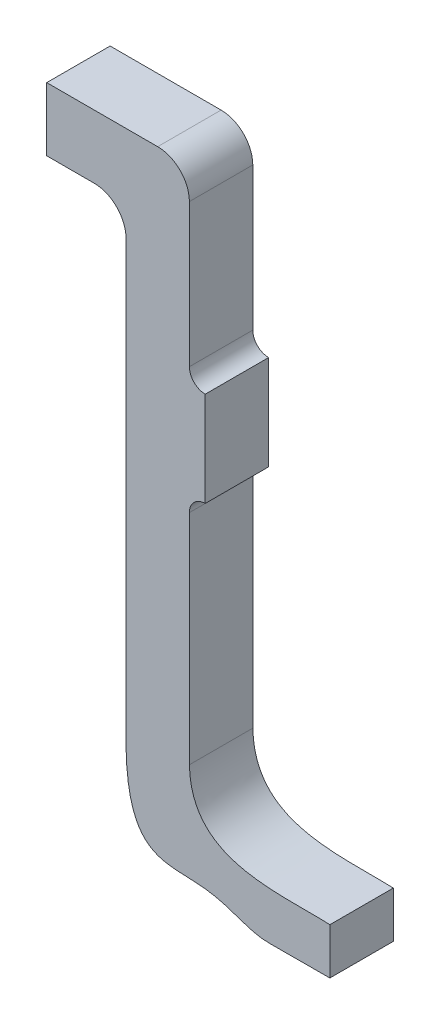
ISO-10303-21;
HEADER;
FILE_DESCRIPTION(('STEP AP214'),'2;1');
FILE_NAME('part.step','',(''),(''),'','','');
FILE_SCHEMA(('AUTOMOTIVE_DESIGN { 1 0 10303 214 1 1 1 1 }'));
ENDSEC;
DATA;
#1=APPLICATION_CONTEXT('core data for automotive mechanical design processes');
#2=APPLICATION_PROTOCOL_DEFINITION('international standard','automotive_design',2000,#1);
#3=PRODUCT_CONTEXT('',#1,'mechanical');
#4=PRODUCT('Part','Part','',(#3));
#5=PRODUCT_RELATED_PRODUCT_CATEGORY('part','',(#4));
#6=PRODUCT_DEFINITION_FORMATION('','',#4);
#7=PRODUCT_DEFINITION_CONTEXT('part definition',#1,'design');
#8=PRODUCT_DEFINITION('design','',#6,#7);
#9=PRODUCT_DEFINITION_SHAPE('','',#8);
#10=(LENGTH_UNIT() NAMED_UNIT(*) SI_UNIT(.MILLI.,.METRE.));
#11=(NAMED_UNIT(*) PLANE_ANGLE_UNIT() SI_UNIT($,.RADIAN.));
#12=(NAMED_UNIT(*) SI_UNIT($,.STERADIAN.) SOLID_ANGLE_UNIT());
#13=UNCERTAINTY_MEASURE_WITH_UNIT(LENGTH_MEASURE(1.E-05),#10,'distance_accuracy_value','');
#14=(GEOMETRIC_REPRESENTATION_CONTEXT(3) GLOBAL_UNCERTAINTY_ASSIGNED_CONTEXT((#13)) GLOBAL_UNIT_ASSIGNED_CONTEXT((#10,
#11,#12)) REPRESENTATION_CONTEXT('',''));
#15=CARTESIAN_POINT('',(0.,0.,0.));
#16=DIRECTION('',(0.,0.,1.));
#17=DIRECTION('',(1.,0.,0.));
#18=AXIS2_PLACEMENT_3D('',#15,#16,#17);
#19=CARTESIAN_POINT('',(0.4,0.,0.2));
#20=DIRECTION('',(1.,0.,0.));
#21=DIRECTION('',(0.,1.,0.));
#22=AXIS2_PLACEMENT_3D('',#19,#20,#21);
#23=PLANE('',#22);
#24=DIRECTION('',(0.,-1.,0.));
#25=VECTOR('',#24,1.);
#26=CARTESIAN_POINT('',(0.4,0.,0.));
#27=LINE('',#26,#25);
#28=CARTESIAN_POINT('',(0.4,1.04971801777675,0.));
#29=VERTEX_POINT('',#28);
#30=CARTESIAN_POINT('',(0.4,0.360929099643731,0.));
#31=VERTEX_POINT('',#30);
#32=EDGE_CURVE('E252',#29,#31,#27,.T.);
#33=ORIENTED_EDGE('',*,*,#32,.F.);
#34=DIRECTION('',(0.,0.,-1.));
#35=VECTOR('',#34,1.);
#36=CARTESIAN_POINT('',(0.4,1.04971801777675,0.2));
#37=LINE('',#36,#35);
#38=CARTESIAN_POINT('',(0.4,1.04971801777675,0.2));
#39=VERTEX_POINT('',#38);
#40=EDGE_CURVE('E293',#29,#39,#37,.F.);
#41=ORIENTED_EDGE('',*,*,#40,.T.);
#42=DIRECTION('',(0.,-1.,0.));
#43=VECTOR('',#42,1.);
#44=CARTESIAN_POINT('',(0.4,0.,0.2));
#45=LINE('',#44,#43);
#46=CARTESIAN_POINT('',(0.4,0.360929099643731,0.2));
#47=VERTEX_POINT('',#46);
#48=EDGE_CURVE('E141',#39,#47,#45,.T.);
#49=ORIENTED_EDGE('',*,*,#48,.T.);
#50=DIRECTION('',(0.,0.,-1.));
#51=VECTOR('',#50,1.);
#52=CARTESIAN_POINT('',(0.4,0.360929099643731,0.2));
#53=LINE('',#52,#51);
#54=EDGE_CURVE('E283',#47,#31,#53,.T.);
#55=ORIENTED_EDGE('',*,*,#54,.T.);
#56=EDGE_LOOP('',(#33,#41,#49,#55));
#57=FACE_BOUND('',#56,.T.);
#58=ADVANCED_FACE('F35',(#57),#23,.T.);
#59=CARTESIAN_POINT('',(0.4,1.89937490231322,0.2));
#60=VERTEX_POINT('',#59);
#61=CARTESIAN_POINT('',(0.4,1.44832216385116,0.2));
#62=VERTEX_POINT('',#61);
#63=EDGE_CURVE('E216',#60,#62,#45,.T.);
#64=ORIENTED_EDGE('',*,*,#63,.T.);
#65=DIRECTION('',(0.,0.,1.));
#66=VECTOR('',#65,1.);
#67=CARTESIAN_POINT('',(0.4,1.44832216385116,0.2));
#68=LINE('',#67,#66);
#69=CARTESIAN_POINT('',(0.4,1.44832216385116,0.));
#70=VERTEX_POINT('',#69);
#71=EDGE_CURVE('E50',#62,#70,#68,.F.);
#72=ORIENTED_EDGE('',*,*,#71,.T.);
#73=CARTESIAN_POINT('',(0.4,1.89937490231322,0.));
#74=VERTEX_POINT('',#73);
#75=EDGE_CURVE('E253',#74,#70,#27,.T.);
#76=ORIENTED_EDGE('',*,*,#75,.F.);
#77=DIRECTION('',(0.,0.,-1.));
#78=VECTOR('',#77,1.);
#79=CARTESIAN_POINT('',(0.4,1.89937490231322,0.2));
#80=LINE('',#79,#78);
#81=EDGE_CURVE('E281',#60,#74,#80,.T.);
#82=ORIENTED_EDGE('',*,*,#81,.F.);
#83=EDGE_LOOP('',(#64,#72,#76,#82));
#84=FACE_BOUND('',#83,.T.);
#85=ADVANCED_FACE('F187',(#84),#23,.T.);
#86=CARTESIAN_POINT('',(0.2,0.,0.2));
#87=DIRECTION('',(1.,0.,0.));
#88=DIRECTION('',(0.,0.,-1.));
#89=AXIS2_PLACEMENT_3D('',#86,#87,#88);
#90=PLANE('',#89);
#91=DIRECTION('',(0.,-1.,0.));
#92=VECTOR('',#91,1.);
#93=CARTESIAN_POINT('',(0.2,0.,0.));
#94=LINE('',#93,#92);
#95=CARTESIAN_POINT('',(0.2,1.69937490231322,0.));
#96=VERTEX_POINT('',#95);
#97=CARTESIAN_POINT('',(0.2,0.313998399548533,0.));
#98=VERTEX_POINT('',#97);
#99=EDGE_CURVE('E163',#96,#98,#94,.T.);
#100=ORIENTED_EDGE('',*,*,#99,.T.);
#101=DIRECTION('',(0.,0.,-1.));
#102=VECTOR('',#101,1.);
#103=CARTESIAN_POINT('',(0.2,0.313998399548533,0.2));
#104=LINE('',#103,#102);
#105=CARTESIAN_POINT('',(0.2,0.313998399548533,0.2));
#106=VERTEX_POINT('',#105);
#107=EDGE_CURVE('E290',#106,#98,#104,.T.);
#108=ORIENTED_EDGE('',*,*,#107,.F.);
#109=DIRECTION('',(0.,-1.,0.));
#110=VECTOR('',#109,1.);
#111=CARTESIAN_POINT('',(0.2,0.,0.2));
#112=LINE('',#111,#110);
#113=CARTESIAN_POINT('',(0.2,1.69937490231322,0.2));
#114=VERTEX_POINT('',#113);
#115=EDGE_CURVE('E164',#114,#106,#112,.T.);
#116=ORIENTED_EDGE('',*,*,#115,.F.);
#117=DIRECTION('',(0.,0.,-1.));
#118=VECTOR('',#117,1.);
#119=CARTESIAN_POINT('',(0.2,1.69937490231322,0.2));
#120=LINE('',#119,#118);
#121=EDGE_CURVE('E233',#114,#96,#120,.T.);
#122=ORIENTED_EDGE('',*,*,#121,.T.);
#123=EDGE_LOOP('',(#100,#108,#116,#122));
#124=FACE_BOUND('',#123,.T.);
#125=ADVANCED_FACE('F183',(#124),#90,.F.);
#126=CARTESIAN_POINT('',(0.2,0.313998399548533,0.2));
#127=CARTESIAN_POINT('',(0.205117782219571,0.0172247900247396,0.2));
#128=CARTESIAN_POINT('',(0.336091092961577,0.0651074279847597,0.2));
#129=CARTESIAN_POINT('',(0.524474595141554,0.0360557759034333,0.2));
#130=CARTESIAN_POINT('',(0.597315341946196,-0.000257939071096465,0.2));
#131=CARTESIAN_POINT('',(0.727358440854403,-0.00108308718081901,0.2));
#132=CARTESIAN_POINT('',(0.736855282235725,0.000318750742657818,0.2));
#133=CARTESIAN_POINT('',(0.843149124587378,0.,0.2));
#134=B_SPLINE_CURVE_WITH_KNOTS('',3,(#126,#127,#128,#129,#130,#131,#132,#133),.UNSPECIFIED.,.F.,
.F.,(4,1,1,1,1,4),(0.,0.386744718019285,0.431584631479445,0.602654436729463,0.661634346147144,
1.),.UNSPECIFIED.);
#135=DIRECTION('',(0.,0.,-1.));
#136=VECTOR('',#135,1.);
#137=SURFACE_OF_LINEAR_EXTRUSION('',#134,#136);
#138=CARTESIAN_POINT('',(0.2,0.313998399548533,0.));
#139=CARTESIAN_POINT('',(0.205117782219571,0.0172247900247396,0.));
#140=CARTESIAN_POINT('',(0.336091092961577,0.0651074279847597,0.));
#141=CARTESIAN_POINT('',(0.524474595141554,0.0360557759034333,0.));
#142=CARTESIAN_POINT('',(0.597315341946196,-0.000257939071096465,0.));
#143=CARTESIAN_POINT('',(0.727358440854403,-0.00108308718081901,0.));
#144=CARTESIAN_POINT('',(0.736855282235725,0.000318750742657818,0.));
#145=CARTESIAN_POINT('',(0.843149124587378,0.,0.));
#146=B_SPLINE_CURVE_WITH_KNOTS('',3,(#138,#139,#140,#141,#142,#143,#144,#145),.UNSPECIFIED.,.F.,
.F.,(4,1,1,1,1,4),(0.,0.386744718019285,0.431584631479445,0.602654436729463,0.661634346147144,
1.),.UNSPECIFIED.);
#147=CARTESIAN_POINT('',(0.843149124587378,0.,0.));
#148=VERTEX_POINT('',#147);
#149=EDGE_CURVE('E236',#98,#148,#146,.T.);
#150=ORIENTED_EDGE('',*,*,#149,.T.);
#151=DIRECTION('',(0.,0.,-1.));
#152=VECTOR('',#151,1.);
#153=CARTESIAN_POINT('',(0.843149124587378,0.,0.2));
#154=LINE('',#153,#152);
#155=CARTESIAN_POINT('',(0.843149124587378,0.,0.2));
#156=VERTEX_POINT('',#155);
#157=EDGE_CURVE('E288',#156,#148,#154,.T.);
#158=ORIENTED_EDGE('',*,*,#157,.F.);
#159=EDGE_CURVE('E166',#106,#156,#134,.T.);
#160=ORIENTED_EDGE('',*,*,#159,.F.);
#161=ORIENTED_EDGE('',*,*,#107,.T.);
#162=EDGE_LOOP('',(#150,#158,#160,#161));
#163=FACE_BOUND('',#162,.T.);
#164=ADVANCED_FACE('F178',(#163),#137,.F.);
#165=CARTESIAN_POINT('',(0.843149124587378,0.,0.2));
#166=DIRECTION('',(1.,0.,0.));
#167=DIRECTION('',(0.,0.,-1.));
#168=AXIS2_PLACEMENT_3D('',#165,#166,#167);
#169=PLANE('',#168);
#170=DIRECTION('',(0.,-1.,0.));
#171=VECTOR('',#170,1.);
#172=CARTESIAN_POINT('',(0.843149124587378,0.,0.));
#173=LINE('',#172,#171);
#174=CARTESIAN_POINT('',(0.843149124587378,0.145674502075926,0.));
#175=VERTEX_POINT('',#174);
#176=EDGE_CURVE('E241',#175,#148,#173,.T.);
#177=ORIENTED_EDGE('',*,*,#176,.F.);
#178=DIRECTION('',(0.,0.,-1.));
#179=VECTOR('',#178,1.);
#180=CARTESIAN_POINT('',(0.843149124587378,0.145674502075926,0.2));
#181=LINE('',#180,#179);
#182=CARTESIAN_POINT('',(0.843149124587378,0.145674502075926,0.2));
#183=VERTEX_POINT('',#182);
#184=EDGE_CURVE('E286',#183,#175,#181,.T.);
#185=ORIENTED_EDGE('',*,*,#184,.F.);
#186=DIRECTION('',(0.,-1.,0.));
#187=VECTOR('',#186,1.);
#188=CARTESIAN_POINT('',(0.843149124587378,0.,0.2));
#189=LINE('',#188,#187);
#190=EDGE_CURVE('E172',#183,#156,#189,.T.);
#191=ORIENTED_EDGE('',*,*,#190,.T.);
#192=ORIENTED_EDGE('',*,*,#157,.T.);
#193=EDGE_LOOP('',(#177,#185,#191,#192));
#194=FACE_BOUND('',#193,.T.);
#195=ADVANCED_FACE('F182',(#194),#169,.T.);
#196=CARTESIAN_POINT('',(0.4,0.360929099643731,0.2));
#197=CARTESIAN_POINT('',(0.405330143536741,0.11057682589153,0.2));
#198=CARTESIAN_POINT('',(0.678357665519726,0.153432988987334,0.2));
#199=CARTESIAN_POINT('',(0.843149124587378,0.145674502075926,0.2));
#200=B_SPLINE_CURVE_WITH_KNOTS('',3,(#196,#197,#198,#199),.UNSPECIFIED.,.F.,.F.,(4,4),(0.,1.),.UNSPECIFIED.);
#201=DIRECTION('',(0.,0.,-1.));
#202=VECTOR('',#201,1.);
#203=SURFACE_OF_LINEAR_EXTRUSION('',#200,#202);
#204=CARTESIAN_POINT('',(0.4,0.360929099643731,0.));
#205=CARTESIAN_POINT('',(0.405330143536741,0.11057682589153,0.));
#206=CARTESIAN_POINT('',(0.678357665519726,0.153432988987334,0.));
#207=CARTESIAN_POINT('',(0.843149124587378,0.145674502075926,0.));
#208=B_SPLINE_CURVE_WITH_KNOTS('',3,(#204,#205,#206,#207),.UNSPECIFIED.,.F.,.F.,(4,4),(0.,1.),.UNSPECIFIED.);
#209=EDGE_CURVE('E247',#31,#175,#208,.T.);
#210=ORIENTED_EDGE('',*,*,#209,.F.);
#211=ORIENTED_EDGE('',*,*,#54,.F.);
#212=EDGE_CURVE('E210',#47,#183,#200,.T.);
#213=ORIENTED_EDGE('',*,*,#212,.T.);
#214=ORIENTED_EDGE('',*,*,#184,.T.);
#215=EDGE_LOOP('',(#210,#211,#213,#214));
#216=FACE_BOUND('',#215,.T.);
#217=ADVANCED_FACE('F207',(#216),#203,.T.);
#218=CARTESIAN_POINT('',(0.3,1.89937490231322,0.2));
#219=DIRECTION('',(0.,0.,-1.));
#220=DIRECTION('',(-1.,0.,0.));
#221=AXIS2_PLACEMENT_3D('',#218,#219,#220);
#222=CYLINDRICAL_SURFACE('',#221,0.1);
#223=CARTESIAN_POINT('',(0.3,1.89937490231322,0.));
#224=DIRECTION('',(0.,0.,1.));
#225=DIRECTION('',(1.,0.,0.));
#226=AXIS2_PLACEMENT_3D('',#223,#224,#225);
#227=CIRCLE('',#226,0.1);
#228=CARTESIAN_POINT('',(0.3,1.99937490231322,0.));
#229=VERTEX_POINT('',#228);
#230=EDGE_CURVE('E258',#74,#229,#227,.T.);
#231=ORIENTED_EDGE('',*,*,#230,.T.);
#232=DIRECTION('',(0.,0.,-1.));
#233=VECTOR('',#232,1.);
#234=CARTESIAN_POINT('',(0.3,1.99937490231322,0.2));
#235=LINE('',#234,#233);
#236=CARTESIAN_POINT('',(0.3,1.99937490231322,0.2));
#237=VERTEX_POINT('',#236);
#238=EDGE_CURVE('E279',#237,#229,#235,.T.);
#239=ORIENTED_EDGE('',*,*,#238,.F.);
#240=CARTESIAN_POINT('',(0.3,1.89937490231322,0.2));
#241=DIRECTION('',(0.,0.,1.));
#242=DIRECTION('',(1.,0.,0.));
#243=AXIS2_PLACEMENT_3D('',#240,#241,#242);
#244=CIRCLE('',#243,0.1);
#245=EDGE_CURVE('E221',#60,#237,#244,.T.);
#246=ORIENTED_EDGE('',*,*,#245,.F.);
#247=ORIENTED_EDGE('',*,*,#81,.T.);
#248=EDGE_LOOP('',(#231,#239,#246,#247));
#249=FACE_BOUND('',#248,.T.);
#250=ADVANCED_FACE('F205',(#249),#222,.T.);
#251=CARTESIAN_POINT('',(0.,1.99937490231322,0.2));
#252=DIRECTION('',(0.,1.,0.));
#253=DIRECTION('',(-1.,0.,0.));
#254=AXIS2_PLACEMENT_3D('',#251,#252,#253);
#255=PLANE('',#254);
#256=DIRECTION('',(1.,0.,0.));
#257=VECTOR('',#256,1.);
#258=CARTESIAN_POINT('',(0.,1.99937490231322,0.));
#259=LINE('',#258,#257);
#260=CARTESIAN_POINT('',(-0.0500000000000001,1.99937490231322,0.));
#261=VERTEX_POINT('',#260);
#262=EDGE_CURVE('E261',#261,#229,#259,.T.);
#263=ORIENTED_EDGE('',*,*,#262,.F.);
#264=DIRECTION('',(0.,0.,-1.));
#265=VECTOR('',#264,1.);
#266=CARTESIAN_POINT('',(-0.0500000000000001,1.99937490231322,0.2));
#267=LINE('',#266,#265);
#268=CARTESIAN_POINT('',(-0.0500000000000001,1.99937490231322,0.2));
#269=VERTEX_POINT('',#268);
#270=EDGE_CURVE('E277',#269,#261,#267,.T.);
#271=ORIENTED_EDGE('',*,*,#270,.F.);
#272=DIRECTION('',(1.,0.,0.));
#273=VECTOR('',#272,1.);
#274=CARTESIAN_POINT('',(0.,1.99937490231322,0.2));
#275=LINE('',#274,#273);
#276=EDGE_CURVE('E223',#269,#237,#275,.T.);
#277=ORIENTED_EDGE('',*,*,#276,.T.);
#278=ORIENTED_EDGE('',*,*,#238,.T.);
#279=EDGE_LOOP('',(#263,#271,#277,#278));
#280=FACE_BOUND('',#279,.T.);
#281=ADVANCED_FACE('F323',(#280),#255,.T.);
#282=CARTESIAN_POINT('',(-0.0500000000000001,0.,0.2));
#283=DIRECTION('',(1.,0.,0.));
#284=DIRECTION('',(0.,0.,-1.));
#285=AXIS2_PLACEMENT_3D('',#282,#283,#284);
#286=PLANE('',#285);
#287=DIRECTION('',(0.,-1.,0.));
#288=VECTOR('',#287,1.);
#289=CARTESIAN_POINT('',(-0.0500000000000001,0.,0.));
#290=LINE('',#289,#288);
#291=CARTESIAN_POINT('',(-0.0500000000000001,1.79937490231322,0.));
#292=VERTEX_POINT('',#291);
#293=EDGE_CURVE('E264',#261,#292,#290,.T.);
#294=ORIENTED_EDGE('',*,*,#293,.T.);
#295=DIRECTION('',(0.,0.,-1.));
#296=VECTOR('',#295,1.);
#297=CARTESIAN_POINT('',(-0.0500000000000001,1.79937490231322,0.2));
#298=LINE('',#297,#296);
#299=CARTESIAN_POINT('',(-0.0500000000000001,1.79937490231322,0.2));
#300=VERTEX_POINT('',#299);
#301=EDGE_CURVE('E275',#300,#292,#298,.T.);
#302=ORIENTED_EDGE('',*,*,#301,.F.);
#303=DIRECTION('',(0.,-1.,0.));
#304=VECTOR('',#303,1.);
#305=CARTESIAN_POINT('',(-0.0500000000000001,0.,0.2));
#306=LINE('',#305,#304);
#307=EDGE_CURVE('E226',#269,#300,#306,.T.);
#308=ORIENTED_EDGE('',*,*,#307,.F.);
#309=ORIENTED_EDGE('',*,*,#270,.T.);
#310=EDGE_LOOP('',(#294,#302,#308,#309));
#311=FACE_BOUND('',#310,.T.);
#312=ADVANCED_FACE('F319',(#311),#286,.F.);
#313=CARTESIAN_POINT('',(0.,1.79937490231322,0.2));
#314=DIRECTION('',(0.,-1.,0.));
#315=DIRECTION('',(0.,0.,-1.));
#316=AXIS2_PLACEMENT_3D('',#313,#314,#315);
#317=PLANE('',#316);
#318=DIRECTION('',(-1.,0.,0.));
#319=VECTOR('',#318,1.);
#320=CARTESIAN_POINT('',(0.,1.79937490231322,0.));
#321=LINE('',#320,#319);
#322=CARTESIAN_POINT('',(0.0999999999999999,1.79937490231322,0.));
#323=VERTEX_POINT('',#322);
#324=EDGE_CURVE('E267',#323,#292,#321,.T.);
#325=ORIENTED_EDGE('',*,*,#324,.F.);
#326=DIRECTION('',(0.,0.,-1.));
#327=VECTOR('',#326,1.);
#328=CARTESIAN_POINT('',(0.0999999999999999,1.79937490231322,0.2));
#329=LINE('',#328,#327);
#330=CARTESIAN_POINT('',(0.0999999999999999,1.79937490231322,0.2));
#331=VERTEX_POINT('',#330);
#332=EDGE_CURVE('E273',#331,#323,#329,.T.);
#333=ORIENTED_EDGE('',*,*,#332,.F.);
#334=DIRECTION('',(-1.,0.,0.));
#335=VECTOR('',#334,1.);
#336=CARTESIAN_POINT('',(0.,1.79937490231322,0.2));
#337=LINE('',#336,#335);
#338=EDGE_CURVE('E228',#331,#300,#337,.T.);
#339=ORIENTED_EDGE('',*,*,#338,.T.);
#340=ORIENTED_EDGE('',*,*,#301,.T.);
#341=EDGE_LOOP('',(#325,#333,#339,#340));
#342=FACE_BOUND('',#341,.T.);
#343=ADVANCED_FACE('F313',(#342),#317,.T.);
#344=CARTESIAN_POINT('',(0.0999999999999999,1.69937490231322,0.2));
#345=DIRECTION('',(0.,0.,-1.));
#346=DIRECTION('',(-1.,0.,0.));
#347=AXIS2_PLACEMENT_3D('',#344,#345,#346);
#348=CYLINDRICAL_SURFACE('',#347,0.0999999999999998);
#349=CARTESIAN_POINT('',(0.0999999999999999,1.69937490231322,0.));
#350=DIRECTION('',(0.,0.,1.));
#351=DIRECTION('',(1.,0.,0.));
#352=AXIS2_PLACEMENT_3D('',#349,#350,#351);
#353=CIRCLE('',#352,0.0999999999999998);
#354=EDGE_CURVE('E167',#323,#96,#353,.F.);
#355=ORIENTED_EDGE('',*,*,#354,.T.);
#356=ORIENTED_EDGE('',*,*,#121,.F.);
#357=CARTESIAN_POINT('',(0.0999999999999999,1.69937490231322,0.2));
#358=DIRECTION('',(0.,0.,1.));
#359=DIRECTION('',(1.,0.,0.));
#360=AXIS2_PLACEMENT_3D('',#357,#358,#359);
#361=CIRCLE('',#360,0.0999999999999998);
#362=EDGE_CURVE('E231',#331,#114,#361,.F.);
#363=ORIENTED_EDGE('',*,*,#362,.F.);
#364=ORIENTED_EDGE('',*,*,#332,.T.);
#365=EDGE_LOOP('',(#355,#356,#363,#364));
#366=FACE_BOUND('',#365,.T.);
#367=ADVANCED_FACE('F329',(#366),#348,.F.);
#368=CARTESIAN_POINT('',(0.,0.,0.2));
#369=DIRECTION('',(0.,0.,1.));
#370=DIRECTION('',(1.,0.,0.));
#371=AXIS2_PLACEMENT_3D('',#368,#369,#370);
#372=PLANE('',#371);
#373=ORIENTED_EDGE('',*,*,#115,.T.);
#374=ORIENTED_EDGE('',*,*,#159,.T.);
#375=ORIENTED_EDGE('',*,*,#190,.F.);
#376=ORIENTED_EDGE('',*,*,#212,.F.);
#377=ORIENTED_EDGE('',*,*,#48,.F.);
#378=CARTESIAN_POINT('',(0.45,1.04971801777675,0.2));
#379=DIRECTION('',(0.,0.,1.));
#380=DIRECTION('',(1.,0.,0.));
#381=AXIS2_PLACEMENT_3D('',#378,#379,#380);
#382=CIRCLE('',#381,0.05);
#383=CARTESIAN_POINT('',(0.45,1.09971801777675,0.2));
#384=VERTEX_POINT('',#383);
#385=EDGE_CURVE('E135',#39,#384,#382,.F.);
#386=ORIENTED_EDGE('',*,*,#385,.T.);
#387=DIRECTION('',(0.,-1.,0.));
#388=VECTOR('',#387,1.);
#389=CARTESIAN_POINT('',(0.45,1.39832216385116,0.2));
#390=LINE('',#389,#388);
#391=CARTESIAN_POINT('',(0.45,1.39832216385116,0.2));
#392=VERTEX_POINT('',#391);
#393=EDGE_CURVE('E139',#392,#384,#390,.T.);
#394=ORIENTED_EDGE('',*,*,#393,.F.);
#395=CARTESIAN_POINT('',(0.45,1.44832216385116,0.2));
#396=DIRECTION('',(0.,0.,1.));
#397=DIRECTION('',(1.,0.,0.));
#398=AXIS2_PLACEMENT_3D('',#395,#396,#397);
#399=CIRCLE('',#398,0.05);
#400=EDGE_CURVE('E43',#392,#62,#399,.F.);
#401=ORIENTED_EDGE('',*,*,#400,.T.);
#402=ORIENTED_EDGE('',*,*,#63,.F.);
#403=ORIENTED_EDGE('',*,*,#245,.T.);
#404=ORIENTED_EDGE('',*,*,#276,.F.);
#405=ORIENTED_EDGE('',*,*,#307,.T.);
#406=ORIENTED_EDGE('',*,*,#338,.F.);
#407=ORIENTED_EDGE('',*,*,#362,.T.);
#408=EDGE_LOOP('',(#373,#374,#375,#376,#377,#386,#394,#401,#402,#403,#404,#405,#406,#407));
#409=FACE_BOUND('',#408,.T.);
#410=ADVANCED_FACE('F138',(#409),#372,.T.);
#411=CARTESIAN_POINT('',(0.,0.,0.));
#412=DIRECTION('',(0.,0.,1.));
#413=DIRECTION('',(1.,0.,0.));
#414=AXIS2_PLACEMENT_3D('',#411,#412,#413);
#415=PLANE('',#414);
#416=ORIENTED_EDGE('',*,*,#99,.F.);
#417=ORIENTED_EDGE('',*,*,#354,.F.);
#418=ORIENTED_EDGE('',*,*,#324,.T.);
#419=ORIENTED_EDGE('',*,*,#293,.F.);
#420=ORIENTED_EDGE('',*,*,#262,.T.);
#421=ORIENTED_EDGE('',*,*,#230,.F.);
#422=ORIENTED_EDGE('',*,*,#75,.T.);
#423=CARTESIAN_POINT('',(0.45,1.44832216385116,0.));
#424=DIRECTION('',(0.,0.,1.));
#425=DIRECTION('',(1.,0.,0.));
#426=AXIS2_PLACEMENT_3D('',#423,#424,#425);
#427=CIRCLE('',#426,0.05);
#428=CARTESIAN_POINT('',(0.45,1.39832216385116,0.));
#429=VERTEX_POINT('',#428);
#430=EDGE_CURVE('E11',#70,#429,#427,.T.);
#431=ORIENTED_EDGE('',*,*,#430,.T.);
#432=DIRECTION('',(0.,1.,0.));
#433=VECTOR('',#432,1.);
#434=CARTESIAN_POINT('',(0.45,1.39832216385116,0.));
#435=LINE('',#434,#433);
#436=CARTESIAN_POINT('',(0.45,1.09971801777675,0.));
#437=VERTEX_POINT('',#436);
#438=EDGE_CURVE('E158',#437,#429,#435,.T.);
#439=ORIENTED_EDGE('',*,*,#438,.F.);
#440=CARTESIAN_POINT('',(0.45,1.04971801777675,0.));
#441=DIRECTION('',(0.,0.,1.));
#442=DIRECTION('',(1.,0.,0.));
#443=AXIS2_PLACEMENT_3D('',#440,#441,#442);
#444=CIRCLE('',#443,0.05);
#445=EDGE_CURVE('E145',#437,#29,#444,.T.);
#446=ORIENTED_EDGE('',*,*,#445,.T.);
#447=ORIENTED_EDGE('',*,*,#32,.T.);
#448=ORIENTED_EDGE('',*,*,#209,.T.);
#449=ORIENTED_EDGE('',*,*,#176,.T.);
#450=ORIENTED_EDGE('',*,*,#149,.F.);
#451=EDGE_LOOP('',(#416,#417,#418,#419,#420,#421,#422,#431,#439,#446,#447,#448,#449,#450));
#452=FACE_BOUND('',#451,.T.);
#453=ADVANCED_FACE('F195',(#452),#415,.F.);
#454=CARTESIAN_POINT('',(0.45,0.,0.));
#455=DIRECTION('',(1.,0.,0.));
#456=DIRECTION('',(0.,0.,-1.));
#457=AXIS2_PLACEMENT_3D('',#454,#455,#456);
#458=PLANE('',#457);
#459=ORIENTED_EDGE('',*,*,#393,.T.);
#460=DIRECTION('',(0.,0.,-1.));
#461=VECTOR('',#460,1.);
#462=CARTESIAN_POINT('',(0.45,1.09971801777675,0.2));
#463=LINE('',#462,#461);
#464=EDGE_CURVE('E152',#384,#437,#463,.T.);
#465=ORIENTED_EDGE('',*,*,#464,.T.);
#466=ORIENTED_EDGE('',*,*,#438,.T.);
#467=DIRECTION('',(0.,0.,1.));
#468=VECTOR('',#467,1.);
#469=CARTESIAN_POINT('',(0.45,1.39832216385116,0.2));
#470=LINE('',#469,#468);
#471=EDGE_CURVE('E155',#429,#392,#470,.T.);
#472=ORIENTED_EDGE('',*,*,#471,.T.);
#473=EDGE_LOOP('',(#459,#465,#466,#472));
#474=FACE_BOUND('',#473,.T.);
#475=ADVANCED_FACE('F150',(#474),#458,.T.);
#476=CARTESIAN_POINT('',(0.45,1.04971801777675,0.2));
#477=DIRECTION('',(0.,0.,-1.));
#478=DIRECTION('',(-1.,0.,0.));
#479=AXIS2_PLACEMENT_3D('',#476,#477,#478);
#480=CYLINDRICAL_SURFACE('',#479,0.05);
#481=ORIENTED_EDGE('',*,*,#385,.F.);
#482=ORIENTED_EDGE('',*,*,#40,.F.);
#483=ORIENTED_EDGE('',*,*,#445,.F.);
#484=ORIENTED_EDGE('',*,*,#464,.F.);
#485=EDGE_LOOP('',(#481,#482,#483,#484));
#486=FACE_BOUND('',#485,.T.);
#487=ADVANCED_FACE('F157',(#486),#480,.F.);
#488=CARTESIAN_POINT('',(0.45,1.44832216385116,0.2));
#489=DIRECTION('',(0.,0.,1.));
#490=DIRECTION('',(1.,0.,0.));
#491=AXIS2_PLACEMENT_3D('',#488,#489,#490);
#492=CYLINDRICAL_SURFACE('',#491,0.05);
#493=ORIENTED_EDGE('',*,*,#430,.F.);
#494=ORIENTED_EDGE('',*,*,#71,.F.);
#495=ORIENTED_EDGE('',*,*,#400,.F.);
#496=ORIENTED_EDGE('',*,*,#471,.F.);
#497=EDGE_LOOP('',(#493,#494,#495,#496));
#498=FACE_BOUND('',#497,.T.);
#499=ADVANCED_FACE('F37',(#498),#492,.F.);
#500=CLOSED_SHELL('',(#58,#85,#125,#164,#195,#217,#250,#281,#312,#343,#367,#410,#453,#475,#487,#499));
#501=MANIFOLD_SOLID_BREP('B2',#500);
#502=ADVANCED_BREP_SHAPE_REPRESENTATION('',(#18,#501),#14);
#503=SHAPE_DEFINITION_REPRESENTATION(#9,#502);
ENDSEC;
END-ISO-10303-21;
